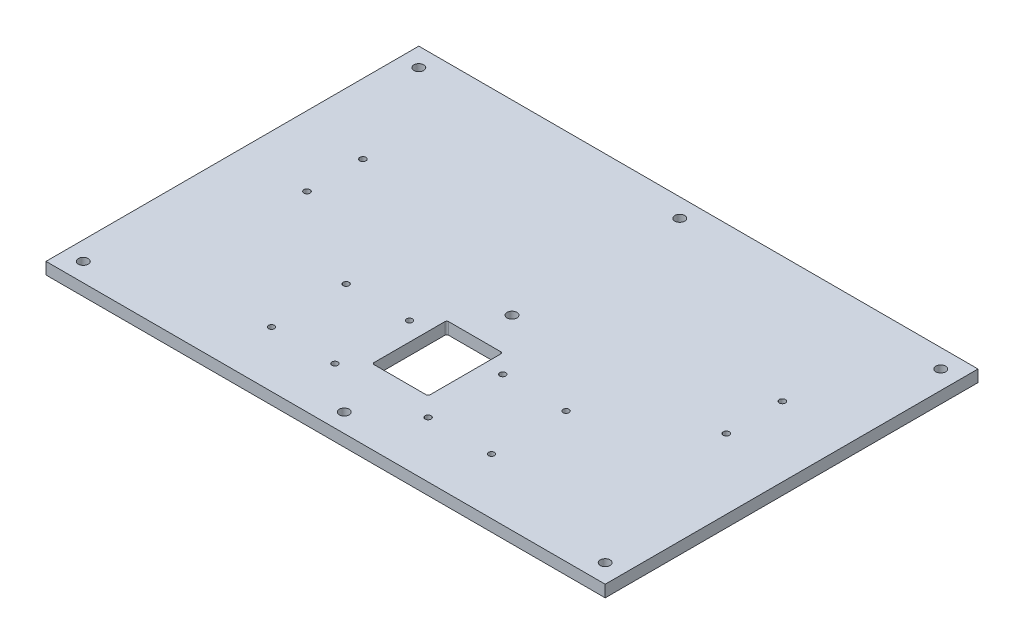
ISO-10303-21;
HEADER;
FILE_DESCRIPTION(('STEP AP214'),'2;1');
FILE_NAME('part.step','',(''),(''),'','','');
FILE_SCHEMA(('AUTOMOTIVE_DESIGN { 1 0 10303 214 1 1 1 1 }'));
ENDSEC;
DATA;
#1=APPLICATION_CONTEXT('core data for automotive mechanical design processes');
#2=APPLICATION_PROTOCOL_DEFINITION('international standard','automotive_design',2000,#1);
#3=PRODUCT_CONTEXT('',#1,'mechanical');
#4=PRODUCT('Part','Part','',(#3));
#5=PRODUCT_RELATED_PRODUCT_CATEGORY('part','',(#4));
#6=PRODUCT_DEFINITION_FORMATION('','',#4);
#7=PRODUCT_DEFINITION_CONTEXT('part definition',#1,'design');
#8=PRODUCT_DEFINITION('design','',#6,#7);
#9=PRODUCT_DEFINITION_SHAPE('','',#8);
#10=(LENGTH_UNIT() NAMED_UNIT(*) SI_UNIT(.MILLI.,.METRE.));
#11=(NAMED_UNIT(*) PLANE_ANGLE_UNIT() SI_UNIT($,.RADIAN.));
#12=(NAMED_UNIT(*) SI_UNIT($,.STERADIAN.) SOLID_ANGLE_UNIT());
#13=UNCERTAINTY_MEASURE_WITH_UNIT(LENGTH_MEASURE(1.E-05),#10,'distance_accuracy_value','');
#14=(GEOMETRIC_REPRESENTATION_CONTEXT(3) GLOBAL_UNCERTAINTY_ASSIGNED_CONTEXT((#13)) GLOBAL_UNIT_ASSIGNED_CONTEXT((#10,
#11,#12)) REPRESENTATION_CONTEXT('',''));
#15=CARTESIAN_POINT('',(0.,0.,0.));
#16=DIRECTION('',(0.,0.,1.));
#17=DIRECTION('',(1.,0.,0.));
#18=AXIS2_PLACEMENT_3D('',#15,#16,#17);
#19=CARTESIAN_POINT('',(0.,-6.35,0.));
#20=DIRECTION('',(0.,1.,0.));
#21=DIRECTION('',(0.,0.,1.));
#22=AXIS2_PLACEMENT_3D('',#19,#20,#21);
#23=PLANE('',#22);
#24=CARTESIAN_POINT('',(-140.,-6.35,-90.));
#25=DIRECTION('',(0.,1.,0.));
#26=DIRECTION('',(0.,0.,1.));
#27=AXIS2_PLACEMENT_3D('',#24,#25,#26);
#28=CIRCLE('',#27,2.64999999999999);
#29=CARTESIAN_POINT('',(-140.,-6.35,-87.35));
#30=VERTEX_POINT('',#29);
#31=EDGE_CURVE('E443',#30,#30,#28,.T.);
#32=ORIENTED_EDGE('',*,*,#31,.T.);
#33=EDGE_LOOP('',(#32));
#34=FACE_BOUND('',#33,.T.);
#35=CARTESIAN_POINT('',(0.,-6.35,-90.));
#36=DIRECTION('',(0.,1.,0.));
#37=DIRECTION('',(0.,0.,1.));
#38=AXIS2_PLACEMENT_3D('',#35,#36,#37);
#39=CIRCLE('',#38,2.65);
#40=CARTESIAN_POINT('',(0.,-6.35,-87.35));
#41=VERTEX_POINT('',#40);
#42=EDGE_CURVE('E435',#41,#41,#39,.T.);
#43=ORIENTED_EDGE('',*,*,#42,.T.);
#44=EDGE_LOOP('',(#43));
#45=FACE_BOUND('',#44,.T.);
#46=CARTESIAN_POINT('',(140.,-6.35,-90.));
#47=DIRECTION('',(0.,1.,0.));
#48=DIRECTION('',(0.,0.,1.));
#49=AXIS2_PLACEMENT_3D('',#46,#47,#48);
#50=CIRCLE('',#49,2.64999999999999);
#51=CARTESIAN_POINT('',(140.,-6.35,-87.35));
#52=VERTEX_POINT('',#51);
#53=EDGE_CURVE('E427',#52,#52,#50,.T.);
#54=ORIENTED_EDGE('',*,*,#53,.T.);
#55=EDGE_LOOP('',(#54));
#56=FACE_BOUND('',#55,.T.);
#57=CARTESIAN_POINT('',(140.,-6.35,90.));
#58=DIRECTION('',(0.,1.,0.));
#59=DIRECTION('',(0.,0.,1.));
#60=AXIS2_PLACEMENT_3D('',#57,#58,#59);
#61=CIRCLE('',#60,2.64999999999999);
#62=CARTESIAN_POINT('',(140.,-6.35,92.6499999999999));
#63=VERTEX_POINT('',#62);
#64=EDGE_CURVE('E419',#63,#63,#61,.T.);
#65=ORIENTED_EDGE('',*,*,#64,.T.);
#66=EDGE_LOOP('',(#65));
#67=FACE_BOUND('',#66,.T.);
#68=CARTESIAN_POINT('',(0.,-6.35,90.));
#69=DIRECTION('',(0.,1.,0.));
#70=DIRECTION('',(0.,0.,1.));
#71=AXIS2_PLACEMENT_3D('',#68,#69,#70);
#72=CIRCLE('',#71,2.65);
#73=CARTESIAN_POINT('',(0.,-6.35,92.65));
#74=VERTEX_POINT('',#73);
#75=EDGE_CURVE('E411',#74,#74,#72,.T.);
#76=ORIENTED_EDGE('',*,*,#75,.T.);
#77=EDGE_LOOP('',(#76));
#78=FACE_BOUND('',#77,.T.);
#79=CARTESIAN_POINT('',(-140.,-6.35,90.));
#80=DIRECTION('',(0.,1.,0.));
#81=DIRECTION('',(0.,0.,1.));
#82=AXIS2_PLACEMENT_3D('',#79,#80,#81);
#83=CIRCLE('',#82,2.64999999999999);
#84=CARTESIAN_POINT('',(-140.,-6.35,92.65));
#85=VERTEX_POINT('',#84);
#86=EDGE_CURVE('E403',#85,#85,#83,.T.);
#87=ORIENTED_EDGE('',*,*,#86,.T.);
#88=EDGE_LOOP('',(#87));
#89=FACE_BOUND('',#88,.T.);
#90=CARTESIAN_POINT('',(0.,-6.35,0.));
#91=DIRECTION('',(0.,1.,0.));
#92=DIRECTION('',(0.,0.,1.));
#93=AXIS2_PLACEMENT_3D('',#90,#91,#92);
#94=CIRCLE('',#93,2.65);
#95=CARTESIAN_POINT('',(0.,-6.35,2.65));
#96=VERTEX_POINT('',#95);
#97=EDGE_CURVE('E395',#96,#96,#94,.T.);
#98=ORIENTED_EDGE('',*,*,#97,.T.);
#99=EDGE_LOOP('',(#98));
#100=FACE_BOUND('',#99,.T.);
#101=CARTESIAN_POINT('',(-59.,-6.35,30.));
#102=DIRECTION('',(0.,1.,0.));
#103=DIRECTION('',(0.,0.,1.));
#104=AXIS2_PLACEMENT_3D('',#101,#102,#103);
#105=CIRCLE('',#104,1.6);
#106=CARTESIAN_POINT('',(-59.,-6.35,31.6));
#107=VERTEX_POINT('',#106);
#108=EDGE_CURVE('E387',#107,#107,#105,.T.);
#109=ORIENTED_EDGE('',*,*,#108,.T.);
#110=EDGE_LOOP('',(#109));
#111=FACE_BOUND('',#110,.T.);
#112=CARTESIAN_POINT('',(-25.,-6.35,30.));
#113=DIRECTION('',(0.,1.,0.));
#114=DIRECTION('',(0.,0.,1.));
#115=AXIS2_PLACEMENT_3D('',#112,#113,#114);
#116=CIRCLE('',#115,1.6);
#117=CARTESIAN_POINT('',(-25.,-6.35,31.6));
#118=VERTEX_POINT('',#117);
#119=EDGE_CURVE('E379',#118,#118,#116,.T.);
#120=ORIENTED_EDGE('',*,*,#119,.T.);
#121=EDGE_LOOP('',(#120));
#122=FACE_BOUND('',#121,.T.);
#123=CARTESIAN_POINT('',(-59.,-6.35,70.));
#124=DIRECTION('',(0.,1.,0.));
#125=DIRECTION('',(0.,0.,1.));
#126=AXIS2_PLACEMENT_3D('',#123,#124,#125);
#127=CIRCLE('',#126,1.6);
#128=CARTESIAN_POINT('',(-59.,-6.35,71.6));
#129=VERTEX_POINT('',#128);
#130=EDGE_CURVE('E371',#129,#129,#127,.T.);
#131=ORIENTED_EDGE('',*,*,#130,.T.);
#132=EDGE_LOOP('',(#131));
#133=FACE_BOUND('',#132,.T.);
#134=CARTESIAN_POINT('',(-25.,-6.35,70.));
#135=DIRECTION('',(0.,1.,0.));
#136=DIRECTION('',(0.,0.,1.));
#137=AXIS2_PLACEMENT_3D('',#134,#135,#136);
#138=CIRCLE('',#137,1.6);
#139=CARTESIAN_POINT('',(-25.,-6.35,71.6));
#140=VERTEX_POINT('',#139);
#141=EDGE_CURVE('E363',#140,#140,#138,.T.);
#142=ORIENTED_EDGE('',*,*,#141,.T.);
#143=EDGE_LOOP('',(#142));
#144=FACE_BOUND('',#143,.T.);
#145=CARTESIAN_POINT('',(25.,-6.35,30.));
#146=DIRECTION('',(0.,1.,0.));
#147=DIRECTION('',(0.,0.,1.));
#148=AXIS2_PLACEMENT_3D('',#145,#146,#147);
#149=CIRCLE('',#148,1.6);
#150=CARTESIAN_POINT('',(25.,-6.35,31.6));
#151=VERTEX_POINT('',#150);
#152=EDGE_CURVE('E355',#151,#151,#149,.T.);
#153=ORIENTED_EDGE('',*,*,#152,.T.);
#154=EDGE_LOOP('',(#153));
#155=FACE_BOUND('',#154,.T.);
#156=CARTESIAN_POINT('',(59.,-6.35,30.));
#157=DIRECTION('',(0.,1.,0.));
#158=DIRECTION('',(0.,0.,1.));
#159=AXIS2_PLACEMENT_3D('',#156,#157,#158);
#160=CIRCLE('',#159,1.6);
#161=CARTESIAN_POINT('',(59.,-6.35,31.6));
#162=VERTEX_POINT('',#161);
#163=EDGE_CURVE('E347',#162,#162,#160,.T.);
#164=ORIENTED_EDGE('',*,*,#163,.T.);
#165=EDGE_LOOP('',(#164));
#166=FACE_BOUND('',#165,.T.);
#167=CARTESIAN_POINT('',(25.,-6.35,70.));
#168=DIRECTION('',(0.,1.,0.));
#169=DIRECTION('',(0.,0.,1.));
#170=AXIS2_PLACEMENT_3D('',#167,#168,#169);
#171=CIRCLE('',#170,1.6);
#172=CARTESIAN_POINT('',(25.,-6.35,71.6));
#173=VERTEX_POINT('',#172);
#174=EDGE_CURVE('E339',#173,#173,#171,.T.);
#175=ORIENTED_EDGE('',*,*,#174,.T.);
#176=EDGE_LOOP('',(#175));
#177=FACE_BOUND('',#176,.T.);
#178=CARTESIAN_POINT('',(59.,-6.35,70.));
#179=DIRECTION('',(0.,1.,0.));
#180=DIRECTION('',(0.,0.,1.));
#181=AXIS2_PLACEMENT_3D('',#178,#179,#180);
#182=CIRCLE('',#181,1.6);
#183=CARTESIAN_POINT('',(59.,-6.35,71.6));
#184=VERTEX_POINT('',#183);
#185=EDGE_CURVE('E331',#184,#184,#182,.T.);
#186=ORIENTED_EDGE('',*,*,#185,.T.);
#187=EDGE_LOOP('',(#186));
#188=FACE_BOUND('',#187,.T.);
#189=CARTESIAN_POINT('',(-112.5,-6.35,-32.5));
#190=DIRECTION('',(0.,1.,0.));
#191=DIRECTION('',(0.,0.,1.));
#192=AXIS2_PLACEMENT_3D('',#189,#190,#191);
#193=CIRCLE('',#192,1.65);
#194=CARTESIAN_POINT('',(-112.5,-6.35,-30.85));
#195=VERTEX_POINT('',#194);
#196=EDGE_CURVE('E323',#195,#195,#193,.T.);
#197=ORIENTED_EDGE('',*,*,#196,.T.);
#198=EDGE_LOOP('',(#197));
#199=FACE_BOUND('',#198,.T.);
#200=CARTESIAN_POINT('',(-112.5,-6.35,-2.5));
#201=DIRECTION('',(0.,1.,0.));
#202=DIRECTION('',(0.,0.,1.));
#203=AXIS2_PLACEMENT_3D('',#200,#201,#202);
#204=CIRCLE('',#203,1.65);
#205=CARTESIAN_POINT('',(-112.5,-6.35,-0.850000000000004));
#206=VERTEX_POINT('',#205);
#207=EDGE_CURVE('E315',#206,#206,#204,.T.);
#208=ORIENTED_EDGE('',*,*,#207,.T.);
#209=EDGE_LOOP('',(#208));
#210=FACE_BOUND('',#209,.T.);
#211=CARTESIAN_POINT('',(112.5,-6.35,-32.5));
#212=DIRECTION('',(0.,1.,0.));
#213=DIRECTION('',(0.,0.,1.));
#214=AXIS2_PLACEMENT_3D('',#211,#212,#213);
#215=CIRCLE('',#214,1.65);
#216=CARTESIAN_POINT('',(112.5,-6.35,-30.85));
#217=VERTEX_POINT('',#216);
#218=EDGE_CURVE('E307',#217,#217,#215,.T.);
#219=ORIENTED_EDGE('',*,*,#218,.T.);
#220=EDGE_LOOP('',(#219));
#221=FACE_BOUND('',#220,.T.);
#222=CARTESIAN_POINT('',(112.5,-6.35,-2.50000000000003));
#223=DIRECTION('',(0.,1.,0.));
#224=DIRECTION('',(0.,0.,1.));
#225=AXIS2_PLACEMENT_3D('',#222,#223,#224);
#226=CIRCLE('',#225,1.65);
#227=CARTESIAN_POINT('',(112.5,-6.35,-0.850000000000031));
#228=VERTEX_POINT('',#227);
#229=EDGE_CURVE('E287',#228,#228,#226,.T.);
#230=ORIENTED_EDGE('',*,*,#229,.T.);
#231=EDGE_LOOP('',(#230));
#232=FACE_BOUND('',#231,.T.);
#233=DIRECTION('',(0.,0.,1.));
#234=VECTOR('',#233,1.);
#235=CARTESIAN_POINT('',(-150.,-6.35,-100.));
#236=LINE('',#235,#234);
#237=CARTESIAN_POINT('',(-150.,-6.35,-100.));
#238=VERTEX_POINT('',#237);
#239=CARTESIAN_POINT('',(-150.,-6.35,100.));
#240=VERTEX_POINT('',#239);
#241=EDGE_CURVE('E169',#238,#240,#236,.T.);
#242=ORIENTED_EDGE('',*,*,#241,.F.);
#243=DIRECTION('',(1.,0.,0.));
#244=VECTOR('',#243,1.);
#245=CARTESIAN_POINT('',(-150.,-6.35,-100.));
#246=LINE('',#245,#244);
#247=CARTESIAN_POINT('',(150.,-6.35,-100.));
#248=VERTEX_POINT('',#247);
#249=EDGE_CURVE('E165',#238,#248,#246,.T.);
#250=ORIENTED_EDGE('',*,*,#249,.T.);
#251=DIRECTION('',(0.,0.,1.));
#252=VECTOR('',#251,1.);
#253=CARTESIAN_POINT('',(150.,-6.35,-100.));
#254=LINE('',#253,#252);
#255=CARTESIAN_POINT('',(150.,-6.35,100.));
#256=VERTEX_POINT('',#255);
#257=EDGE_CURVE('E171',#248,#256,#254,.T.);
#258=ORIENTED_EDGE('',*,*,#257,.T.);
#259=DIRECTION('',(1.,0.,0.));
#260=VECTOR('',#259,1.);
#261=CARTESIAN_POINT('',(-150.,-6.35,100.));
#262=LINE('',#261,#260);
#263=EDGE_CURVE('E156',#240,#256,#262,.T.);
#264=ORIENTED_EDGE('',*,*,#263,.F.);
#265=EDGE_LOOP('',(#242,#250,#258,#264));
#266=FACE_BOUND('',#265,.T.);
#267=DIRECTION('',(0.,0.,1.));
#268=VECTOR('',#267,1.);
#269=CARTESIAN_POINT('',(15.,-6.35,0.));
#270=LINE('',#269,#268);
#271=CARTESIAN_POINT('',(15.,-6.35,21.));
#272=VERTEX_POINT('',#271);
#273=CARTESIAN_POINT('',(15.,-6.35,59.));
#274=VERTEX_POINT('',#273);
#275=EDGE_CURVE('E281',#272,#274,#270,.T.);
#276=ORIENTED_EDGE('',*,*,#275,.F.);
#277=CARTESIAN_POINT('',(14.,-6.35,21.));
#278=DIRECTION('',(0.,1.,0.));
#279=DIRECTION('',(0.,0.,1.));
#280=AXIS2_PLACEMENT_3D('',#277,#278,#279);
#281=CIRCLE('',#280,1.);
#282=CARTESIAN_POINT('',(14.,-6.35,20.));
#283=VERTEX_POINT('',#282);
#284=EDGE_CURVE('E239',#272,#283,#281,.T.);
#285=ORIENTED_EDGE('',*,*,#284,.T.);
#286=DIRECTION('',(1.,0.,0.));
#287=VECTOR('',#286,1.);
#288=CARTESIAN_POINT('',(0.,-6.35,20.));
#289=LINE('',#288,#287);
#290=CARTESIAN_POINT('',(-14.,-6.35,20.));
#291=VERTEX_POINT('',#290);
#292=EDGE_CURVE('E275',#291,#283,#289,.T.);
#293=ORIENTED_EDGE('',*,*,#292,.F.);
#294=CARTESIAN_POINT('',(-14.,-6.35,21.));
#295=DIRECTION('',(0.,1.,0.));
#296=DIRECTION('',(0.,0.,1.));
#297=AXIS2_PLACEMENT_3D('',#294,#295,#296);
#298=CIRCLE('',#297,1.);
#299=CARTESIAN_POINT('',(-15.,-6.35,21.));
#300=VERTEX_POINT('',#299);
#301=EDGE_CURVE('E12',#291,#300,#298,.T.);
#302=ORIENTED_EDGE('',*,*,#301,.T.);
#303=DIRECTION('',(0.,0.,1.));
#304=VECTOR('',#303,1.);
#305=CARTESIAN_POINT('',(-15.,-6.35,0.));
#306=LINE('',#305,#304);
#307=CARTESIAN_POINT('',(-15.,-6.35,59.));
#308=VERTEX_POINT('',#307);
#309=EDGE_CURVE('E272',#300,#308,#306,.T.);
#310=ORIENTED_EDGE('',*,*,#309,.T.);
#311=CARTESIAN_POINT('',(-14.,-6.35,59.));
#312=DIRECTION('',(0.,1.,0.));
#313=DIRECTION('',(0.,0.,1.));
#314=AXIS2_PLACEMENT_3D('',#311,#312,#313);
#315=CIRCLE('',#314,1.);
#316=CARTESIAN_POINT('',(-14.,-6.35,60.));
#317=VERTEX_POINT('',#316);
#318=EDGE_CURVE('E251',#308,#317,#315,.T.);
#319=ORIENTED_EDGE('',*,*,#318,.T.);
#320=DIRECTION('',(1.,0.,0.));
#321=VECTOR('',#320,1.);
#322=CARTESIAN_POINT('',(0.,-6.35,60.));
#323=LINE('',#322,#321);
#324=CARTESIAN_POINT('',(14.,-6.35,60.));
#325=VERTEX_POINT('',#324);
#326=EDGE_CURVE('E195',#317,#325,#323,.T.);
#327=ORIENTED_EDGE('',*,*,#326,.T.);
#328=CARTESIAN_POINT('',(14.,-6.35,59.));
#329=DIRECTION('',(0.,1.,0.));
#330=DIRECTION('',(0.,0.,1.));
#331=AXIS2_PLACEMENT_3D('',#328,#329,#330);
#332=CIRCLE('',#331,1.);
#333=EDGE_CURVE('E245',#325,#274,#332,.T.);
#334=ORIENTED_EDGE('',*,*,#333,.T.);
#335=EDGE_LOOP('',(#276,#285,#293,#302,#310,#319,#327,#334));
#336=FACE_BOUND('',#335,.T.);
#337=ADVANCED_FACE('F63',(#34,#45,#56,#67,#78,#89,#100,#111,#122,#133,#144,#155,#166,#177,#188,
#199,#210,#221,#232,#266,#336),#23,.F.);
#338=CARTESIAN_POINT('',(0.,0.,0.));
#339=DIRECTION('',(0.,1.,0.));
#340=DIRECTION('',(0.,0.,1.));
#341=AXIS2_PLACEMENT_3D('',#338,#339,#340);
#342=PLANE('',#341);
#343=CARTESIAN_POINT('',(-140.,0.,-90.));
#344=DIRECTION('',(0.,1.,0.));
#345=DIRECTION('',(0.,0.,1.));
#346=AXIS2_PLACEMENT_3D('',#343,#344,#345);
#347=CIRCLE('',#346,2.64999999999999);
#348=CARTESIAN_POINT('',(-140.,0.,-87.35));
#349=VERTEX_POINT('',#348);
#350=EDGE_CURVE('E447',#349,#349,#347,.T.);
#351=ORIENTED_EDGE('',*,*,#350,.F.);
#352=EDGE_LOOP('',(#351));
#353=FACE_BOUND('',#352,.T.);
#354=CARTESIAN_POINT('',(0.,0.,-90.));
#355=DIRECTION('',(0.,1.,0.));
#356=DIRECTION('',(0.,0.,1.));
#357=AXIS2_PLACEMENT_3D('',#354,#355,#356);
#358=CIRCLE('',#357,2.65);
#359=CARTESIAN_POINT('',(0.,0.,-87.35));
#360=VERTEX_POINT('',#359);
#361=EDGE_CURVE('E439',#360,#360,#358,.T.);
#362=ORIENTED_EDGE('',*,*,#361,.F.);
#363=EDGE_LOOP('',(#362));
#364=FACE_BOUND('',#363,.T.);
#365=CARTESIAN_POINT('',(140.,0.,-90.));
#366=DIRECTION('',(0.,1.,0.));
#367=DIRECTION('',(0.,0.,1.));
#368=AXIS2_PLACEMENT_3D('',#365,#366,#367);
#369=CIRCLE('',#368,2.64999999999999);
#370=CARTESIAN_POINT('',(140.,0.,-87.35));
#371=VERTEX_POINT('',#370);
#372=EDGE_CURVE('E431',#371,#371,#369,.T.);
#373=ORIENTED_EDGE('',*,*,#372,.F.);
#374=EDGE_LOOP('',(#373));
#375=FACE_BOUND('',#374,.T.);
#376=CARTESIAN_POINT('',(140.,0.,90.));
#377=DIRECTION('',(0.,1.,0.));
#378=DIRECTION('',(0.,0.,1.));
#379=AXIS2_PLACEMENT_3D('',#376,#377,#378);
#380=CIRCLE('',#379,2.64999999999999);
#381=CARTESIAN_POINT('',(140.,0.,92.6499999999999));
#382=VERTEX_POINT('',#381);
#383=EDGE_CURVE('E423',#382,#382,#380,.T.);
#384=ORIENTED_EDGE('',*,*,#383,.F.);
#385=EDGE_LOOP('',(#384));
#386=FACE_BOUND('',#385,.T.);
#387=CARTESIAN_POINT('',(0.,0.,90.));
#388=DIRECTION('',(0.,1.,0.));
#389=DIRECTION('',(0.,0.,1.));
#390=AXIS2_PLACEMENT_3D('',#387,#388,#389);
#391=CIRCLE('',#390,2.65);
#392=CARTESIAN_POINT('',(0.,0.,92.65));
#393=VERTEX_POINT('',#392);
#394=EDGE_CURVE('E415',#393,#393,#391,.T.);
#395=ORIENTED_EDGE('',*,*,#394,.F.);
#396=EDGE_LOOP('',(#395));
#397=FACE_BOUND('',#396,.T.);
#398=CARTESIAN_POINT('',(-140.,0.,90.));
#399=DIRECTION('',(0.,1.,0.));
#400=DIRECTION('',(0.,0.,1.));
#401=AXIS2_PLACEMENT_3D('',#398,#399,#400);
#402=CIRCLE('',#401,2.64999999999999);
#403=CARTESIAN_POINT('',(-140.,0.,92.65));
#404=VERTEX_POINT('',#403);
#405=EDGE_CURVE('E407',#404,#404,#402,.T.);
#406=ORIENTED_EDGE('',*,*,#405,.F.);
#407=EDGE_LOOP('',(#406));
#408=FACE_BOUND('',#407,.T.);
#409=CARTESIAN_POINT('',(0.,0.,0.));
#410=DIRECTION('',(0.,1.,0.));
#411=DIRECTION('',(0.,0.,1.));
#412=AXIS2_PLACEMENT_3D('',#409,#410,#411);
#413=CIRCLE('',#412,2.65);
#414=CARTESIAN_POINT('',(0.,0.,2.65));
#415=VERTEX_POINT('',#414);
#416=EDGE_CURVE('E399',#415,#415,#413,.T.);
#417=ORIENTED_EDGE('',*,*,#416,.F.);
#418=EDGE_LOOP('',(#417));
#419=FACE_BOUND('',#418,.T.);
#420=CARTESIAN_POINT('',(-59.,0.,30.));
#421=DIRECTION('',(0.,1.,0.));
#422=DIRECTION('',(0.,0.,1.));
#423=AXIS2_PLACEMENT_3D('',#420,#421,#422);
#424=CIRCLE('',#423,1.6);
#425=CARTESIAN_POINT('',(-59.,0.,31.6));
#426=VERTEX_POINT('',#425);
#427=EDGE_CURVE('E391',#426,#426,#424,.T.);
#428=ORIENTED_EDGE('',*,*,#427,.F.);
#429=EDGE_LOOP('',(#428));
#430=FACE_BOUND('',#429,.T.);
#431=CARTESIAN_POINT('',(-25.,0.,30.));
#432=DIRECTION('',(0.,1.,0.));
#433=DIRECTION('',(0.,0.,1.));
#434=AXIS2_PLACEMENT_3D('',#431,#432,#433);
#435=CIRCLE('',#434,1.6);
#436=CARTESIAN_POINT('',(-25.,0.,31.6));
#437=VERTEX_POINT('',#436);
#438=EDGE_CURVE('E383',#437,#437,#435,.T.);
#439=ORIENTED_EDGE('',*,*,#438,.F.);
#440=EDGE_LOOP('',(#439));
#441=FACE_BOUND('',#440,.T.);
#442=CARTESIAN_POINT('',(-59.,0.,70.));
#443=DIRECTION('',(0.,1.,0.));
#444=DIRECTION('',(0.,0.,1.));
#445=AXIS2_PLACEMENT_3D('',#442,#443,#444);
#446=CIRCLE('',#445,1.6);
#447=CARTESIAN_POINT('',(-59.,0.,71.6));
#448=VERTEX_POINT('',#447);
#449=EDGE_CURVE('E375',#448,#448,#446,.T.);
#450=ORIENTED_EDGE('',*,*,#449,.F.);
#451=EDGE_LOOP('',(#450));
#452=FACE_BOUND('',#451,.T.);
#453=CARTESIAN_POINT('',(-25.,0.,70.));
#454=DIRECTION('',(0.,1.,0.));
#455=DIRECTION('',(0.,0.,1.));
#456=AXIS2_PLACEMENT_3D('',#453,#454,#455);
#457=CIRCLE('',#456,1.6);
#458=CARTESIAN_POINT('',(-25.,0.,71.6));
#459=VERTEX_POINT('',#458);
#460=EDGE_CURVE('E367',#459,#459,#457,.T.);
#461=ORIENTED_EDGE('',*,*,#460,.F.);
#462=EDGE_LOOP('',(#461));
#463=FACE_BOUND('',#462,.T.);
#464=CARTESIAN_POINT('',(25.,0.,30.));
#465=DIRECTION('',(0.,1.,0.));
#466=DIRECTION('',(0.,0.,1.));
#467=AXIS2_PLACEMENT_3D('',#464,#465,#466);
#468=CIRCLE('',#467,1.6);
#469=CARTESIAN_POINT('',(25.,0.,31.6));
#470=VERTEX_POINT('',#469);
#471=EDGE_CURVE('E359',#470,#470,#468,.T.);
#472=ORIENTED_EDGE('',*,*,#471,.F.);
#473=EDGE_LOOP('',(#472));
#474=FACE_BOUND('',#473,.T.);
#475=CARTESIAN_POINT('',(59.,0.,30.));
#476=DIRECTION('',(0.,1.,0.));
#477=DIRECTION('',(0.,0.,1.));
#478=AXIS2_PLACEMENT_3D('',#475,#476,#477);
#479=CIRCLE('',#478,1.6);
#480=CARTESIAN_POINT('',(59.,0.,31.6));
#481=VERTEX_POINT('',#480);
#482=EDGE_CURVE('E351',#481,#481,#479,.T.);
#483=ORIENTED_EDGE('',*,*,#482,.F.);
#484=EDGE_LOOP('',(#483));
#485=FACE_BOUND('',#484,.T.);
#486=CARTESIAN_POINT('',(25.,0.,70.));
#487=DIRECTION('',(0.,1.,0.));
#488=DIRECTION('',(0.,0.,1.));
#489=AXIS2_PLACEMENT_3D('',#486,#487,#488);
#490=CIRCLE('',#489,1.6);
#491=CARTESIAN_POINT('',(25.,0.,71.6));
#492=VERTEX_POINT('',#491);
#493=EDGE_CURVE('E343',#492,#492,#490,.T.);
#494=ORIENTED_EDGE('',*,*,#493,.F.);
#495=EDGE_LOOP('',(#494));
#496=FACE_BOUND('',#495,.T.);
#497=CARTESIAN_POINT('',(59.,0.,70.));
#498=DIRECTION('',(0.,1.,0.));
#499=DIRECTION('',(0.,0.,1.));
#500=AXIS2_PLACEMENT_3D('',#497,#498,#499);
#501=CIRCLE('',#500,1.6);
#502=CARTESIAN_POINT('',(59.,0.,71.6));
#503=VERTEX_POINT('',#502);
#504=EDGE_CURVE('E335',#503,#503,#501,.T.);
#505=ORIENTED_EDGE('',*,*,#504,.F.);
#506=EDGE_LOOP('',(#505));
#507=FACE_BOUND('',#506,.T.);
#508=CARTESIAN_POINT('',(-112.5,0.,-32.5));
#509=DIRECTION('',(0.,1.,0.));
#510=DIRECTION('',(0.,0.,1.));
#511=AXIS2_PLACEMENT_3D('',#508,#509,#510);
#512=CIRCLE('',#511,1.65);
#513=CARTESIAN_POINT('',(-112.5,0.,-30.85));
#514=VERTEX_POINT('',#513);
#515=EDGE_CURVE('E327',#514,#514,#512,.T.);
#516=ORIENTED_EDGE('',*,*,#515,.F.);
#517=EDGE_LOOP('',(#516));
#518=FACE_BOUND('',#517,.T.);
#519=CARTESIAN_POINT('',(-112.5,0.,-2.5));
#520=DIRECTION('',(0.,1.,0.));
#521=DIRECTION('',(0.,0.,1.));
#522=AXIS2_PLACEMENT_3D('',#519,#520,#521);
#523=CIRCLE('',#522,1.65);
#524=CARTESIAN_POINT('',(-112.5,0.,-0.850000000000004));
#525=VERTEX_POINT('',#524);
#526=EDGE_CURVE('E319',#525,#525,#523,.T.);
#527=ORIENTED_EDGE('',*,*,#526,.F.);
#528=EDGE_LOOP('',(#527));
#529=FACE_BOUND('',#528,.T.);
#530=CARTESIAN_POINT('',(112.5,0.,-32.5));
#531=DIRECTION('',(0.,1.,0.));
#532=DIRECTION('',(0.,0.,1.));
#533=AXIS2_PLACEMENT_3D('',#530,#531,#532);
#534=CIRCLE('',#533,1.65);
#535=CARTESIAN_POINT('',(112.5,0.,-30.85));
#536=VERTEX_POINT('',#535);
#537=EDGE_CURVE('E311',#536,#536,#534,.T.);
#538=ORIENTED_EDGE('',*,*,#537,.F.);
#539=EDGE_LOOP('',(#538));
#540=FACE_BOUND('',#539,.T.);
#541=CARTESIAN_POINT('',(112.5,0.,-2.50000000000003));
#542=DIRECTION('',(0.,1.,0.));
#543=DIRECTION('',(0.,0.,1.));
#544=AXIS2_PLACEMENT_3D('',#541,#542,#543);
#545=CIRCLE('',#544,1.65);
#546=CARTESIAN_POINT('',(112.5,0.,-0.850000000000031));
#547=VERTEX_POINT('',#546);
#548=EDGE_CURVE('E303',#547,#547,#545,.T.);
#549=ORIENTED_EDGE('',*,*,#548,.F.);
#550=EDGE_LOOP('',(#549));
#551=FACE_BOUND('',#550,.T.);
#552=DIRECTION('',(0.,0.,1.));
#553=VECTOR('',#552,1.);
#554=CARTESIAN_POINT('',(-150.,0.,-100.));
#555=LINE('',#554,#553);
#556=CARTESIAN_POINT('',(-150.,0.,-100.));
#557=VERTEX_POINT('',#556);
#558=CARTESIAN_POINT('',(-150.,0.,100.));
#559=VERTEX_POINT('',#558);
#560=EDGE_CURVE('E192',#557,#559,#555,.T.);
#561=ORIENTED_EDGE('',*,*,#560,.T.);
#562=DIRECTION('',(1.,0.,0.));
#563=VECTOR('',#562,1.);
#564=CARTESIAN_POINT('',(-150.,0.,100.));
#565=LINE('',#564,#563);
#566=CARTESIAN_POINT('',(150.,0.,100.));
#567=VERTEX_POINT('',#566);
#568=EDGE_CURVE('E158',#559,#567,#565,.T.);
#569=ORIENTED_EDGE('',*,*,#568,.T.);
#570=DIRECTION('',(0.,0.,1.));
#571=VECTOR('',#570,1.);
#572=CARTESIAN_POINT('',(150.,0.,-100.));
#573=LINE('',#572,#571);
#574=CARTESIAN_POINT('',(150.,0.,-100.));
#575=VERTEX_POINT('',#574);
#576=EDGE_CURVE('E182',#575,#567,#573,.T.);
#577=ORIENTED_EDGE('',*,*,#576,.F.);
#578=DIRECTION('',(1.,0.,0.));
#579=VECTOR('',#578,1.);
#580=CARTESIAN_POINT('',(-150.,0.,-100.));
#581=LINE('',#580,#579);
#582=EDGE_CURVE('E179',#557,#575,#581,.T.);
#583=ORIENTED_EDGE('',*,*,#582,.F.);
#584=EDGE_LOOP('',(#561,#569,#577,#583));
#585=FACE_BOUND('',#584,.T.);
#586=DIRECTION('',(0.,0.,1.));
#587=VECTOR('',#586,1.);
#588=CARTESIAN_POINT('',(-15.,0.,0.));
#589=LINE('',#588,#587);
#590=CARTESIAN_POINT('',(-15.,0.,21.));
#591=VERTEX_POINT('',#590);
#592=CARTESIAN_POINT('',(-15.,0.,59.));
#593=VERTEX_POINT('',#592);
#594=EDGE_CURVE('E260',#591,#593,#589,.T.);
#595=ORIENTED_EDGE('',*,*,#594,.F.);
#596=CARTESIAN_POINT('',(-14.,0.,21.));
#597=DIRECTION('',(0.,1.,0.));
#598=DIRECTION('',(0.,0.,1.));
#599=AXIS2_PLACEMENT_3D('',#596,#597,#598);
#600=CIRCLE('',#599,1.);
#601=CARTESIAN_POINT('',(-14.,0.,20.));
#602=VERTEX_POINT('',#601);
#603=EDGE_CURVE('E72',#591,#602,#600,.F.);
#604=ORIENTED_EDGE('',*,*,#603,.T.);
#605=DIRECTION('',(1.,0.,0.));
#606=VECTOR('',#605,1.);
#607=CARTESIAN_POINT('',(0.,0.,20.));
#608=LINE('',#607,#606);
#609=CARTESIAN_POINT('',(14.,0.,20.));
#610=VERTEX_POINT('',#609);
#611=EDGE_CURVE('E259',#602,#610,#608,.T.);
#612=ORIENTED_EDGE('',*,*,#611,.T.);
#613=CARTESIAN_POINT('',(14.,0.,21.));
#614=DIRECTION('',(0.,1.,0.));
#615=DIRECTION('',(0.,0.,1.));
#616=AXIS2_PLACEMENT_3D('',#613,#614,#615);
#617=CIRCLE('',#616,1.);
#618=CARTESIAN_POINT('',(15.,0.,21.));
#619=VERTEX_POINT('',#618);
#620=EDGE_CURVE('E236',#610,#619,#617,.F.);
#621=ORIENTED_EDGE('',*,*,#620,.T.);
#622=DIRECTION('',(0.,0.,1.));
#623=VECTOR('',#622,1.);
#624=CARTESIAN_POINT('',(15.,0.,0.));
#625=LINE('',#624,#623);
#626=CARTESIAN_POINT('',(15.,0.,59.));
#627=VERTEX_POINT('',#626);
#628=EDGE_CURVE('E269',#619,#627,#625,.T.);
#629=ORIENTED_EDGE('',*,*,#628,.T.);
#630=CARTESIAN_POINT('',(14.,0.,59.));
#631=DIRECTION('',(0.,1.,0.));
#632=DIRECTION('',(0.,0.,1.));
#633=AXIS2_PLACEMENT_3D('',#630,#631,#632);
#634=CIRCLE('',#633,1.);
#635=CARTESIAN_POINT('',(14.,0.,60.));
#636=VERTEX_POINT('',#635);
#637=EDGE_CURVE('E242',#627,#636,#634,.F.);
#638=ORIENTED_EDGE('',*,*,#637,.T.);
#639=DIRECTION('',(1.,0.,0.));
#640=VECTOR('',#639,1.);
#641=CARTESIAN_POINT('',(0.,0.,60.));
#642=LINE('',#641,#640);
#643=CARTESIAN_POINT('',(-14.,0.,60.));
#644=VERTEX_POINT('',#643);
#645=EDGE_CURVE('E185',#644,#636,#642,.T.);
#646=ORIENTED_EDGE('',*,*,#645,.F.);
#647=CARTESIAN_POINT('',(-14.,0.,59.));
#648=DIRECTION('',(0.,1.,0.));
#649=DIRECTION('',(0.,0.,1.));
#650=AXIS2_PLACEMENT_3D('',#647,#648,#649);
#651=CIRCLE('',#650,1.);
#652=EDGE_CURVE('E248',#644,#593,#651,.F.);
#653=ORIENTED_EDGE('',*,*,#652,.T.);
#654=EDGE_LOOP('',(#595,#604,#612,#621,#629,#638,#646,#653));
#655=FACE_BOUND('',#654,.T.);
#656=ADVANCED_FACE('F258',(#353,#364,#375,#386,#397,#408,#419,#430,#441,#452,#463,#474,#485,
#496,#507,#518,#529,#540,#551,#585,#655),#342,.T.);
#657=CARTESIAN_POINT('',(-150.,-6.35,-100.));
#658=DIRECTION('',(-1.,0.,0.));
#659=DIRECTION('',(0.,0.,1.));
#660=AXIS2_PLACEMENT_3D('',#657,#658,#659);
#661=PLANE('',#660);
#662=ORIENTED_EDGE('',*,*,#560,.F.);
#663=DIRECTION('',(0.,1.,0.));
#664=VECTOR('',#663,1.);
#665=CARTESIAN_POINT('',(-150.,-6.35,-100.));
#666=LINE('',#665,#664);
#667=EDGE_CURVE('E176',#238,#557,#666,.T.);
#668=ORIENTED_EDGE('',*,*,#667,.F.);
#669=ORIENTED_EDGE('',*,*,#241,.T.);
#670=DIRECTION('',(0.,1.,0.));
#671=VECTOR('',#670,1.);
#672=CARTESIAN_POINT('',(-150.,-6.35,100.));
#673=LINE('',#672,#671);
#674=EDGE_CURVE('E153',#240,#559,#673,.T.);
#675=ORIENTED_EDGE('',*,*,#674,.T.);
#676=EDGE_LOOP('',(#662,#668,#669,#675));
#677=FACE_BOUND('',#676,.T.);
#678=ADVANCED_FACE('F175',(#677),#661,.T.);
#679=CARTESIAN_POINT('',(-150.,-6.35,-100.));
#680=DIRECTION('',(0.,0.,1.));
#681=DIRECTION('',(1.,0.,0.));
#682=AXIS2_PLACEMENT_3D('',#679,#680,#681);
#683=PLANE('',#682);
#684=ORIENTED_EDGE('',*,*,#582,.T.);
#685=DIRECTION('',(0.,1.,0.));
#686=VECTOR('',#685,1.);
#687=CARTESIAN_POINT('',(150.,-6.35,-100.));
#688=LINE('',#687,#686);
#689=EDGE_CURVE('E204',#248,#575,#688,.T.);
#690=ORIENTED_EDGE('',*,*,#689,.F.);
#691=ORIENTED_EDGE('',*,*,#249,.F.);
#692=ORIENTED_EDGE('',*,*,#667,.T.);
#693=EDGE_LOOP('',(#684,#690,#691,#692));
#694=FACE_BOUND('',#693,.T.);
#695=ADVANCED_FACE('F497',(#694),#683,.F.);
#696=CARTESIAN_POINT('',(150.,-6.35,-100.));
#697=DIRECTION('',(-1.,0.,0.));
#698=DIRECTION('',(0.,0.,1.));
#699=AXIS2_PLACEMENT_3D('',#696,#697,#698);
#700=PLANE('',#699);
#701=ORIENTED_EDGE('',*,*,#576,.T.);
#702=DIRECTION('',(0.,1.,0.));
#703=VECTOR('',#702,1.);
#704=CARTESIAN_POINT('',(150.,-6.35,100.));
#705=LINE('',#704,#703);
#706=EDGE_CURVE('E164',#256,#567,#705,.T.);
#707=ORIENTED_EDGE('',*,*,#706,.F.);
#708=ORIENTED_EDGE('',*,*,#257,.F.);
#709=ORIENTED_EDGE('',*,*,#689,.T.);
#710=EDGE_LOOP('',(#701,#707,#708,#709));
#711=FACE_BOUND('',#710,.T.);
#712=ADVANCED_FACE('F499',(#711),#700,.F.);
#713=CARTESIAN_POINT('',(-150.,-6.35,100.));
#714=DIRECTION('',(0.,0.,1.));
#715=DIRECTION('',(1.,0.,0.));
#716=AXIS2_PLACEMENT_3D('',#713,#714,#715);
#717=PLANE('',#716);
#718=ORIENTED_EDGE('',*,*,#568,.F.);
#719=ORIENTED_EDGE('',*,*,#674,.F.);
#720=ORIENTED_EDGE('',*,*,#263,.T.);
#721=ORIENTED_EDGE('',*,*,#706,.T.);
#722=EDGE_LOOP('',(#718,#719,#720,#721));
#723=FACE_BOUND('',#722,.T.);
#724=ADVANCED_FACE('F155',(#723),#717,.T.);
#725=CARTESIAN_POINT('',(15.,-6.35,0.));
#726=DIRECTION('',(-1.,0.,0.));
#727=DIRECTION('',(0.,0.,1.));
#728=AXIS2_PLACEMENT_3D('',#725,#726,#727);
#729=PLANE('',#728);
#730=ORIENTED_EDGE('',*,*,#628,.F.);
#731=DIRECTION('',(0.,1.,0.));
#732=VECTOR('',#731,1.);
#733=CARTESIAN_POINT('',(15.,-6.35,21.));
#734=LINE('',#733,#732);
#735=EDGE_CURVE('E220',#619,#272,#734,.F.);
#736=ORIENTED_EDGE('',*,*,#735,.T.);
#737=ORIENTED_EDGE('',*,*,#275,.T.);
#738=DIRECTION('',(0.,1.,0.));
#739=VECTOR('',#738,1.);
#740=CARTESIAN_POINT('',(15.,-6.35,59.));
#741=LINE('',#740,#739);
#742=EDGE_CURVE('E216',#274,#627,#741,.T.);
#743=ORIENTED_EDGE('',*,*,#742,.T.);
#744=EDGE_LOOP('',(#730,#736,#737,#743));
#745=FACE_BOUND('',#744,.T.);
#746=ADVANCED_FACE('F506',(#745),#729,.T.);
#747=CARTESIAN_POINT('',(0.,-6.35,60.));
#748=DIRECTION('',(0.,0.,1.));
#749=DIRECTION('',(1.,0.,0.));
#750=AXIS2_PLACEMENT_3D('',#747,#748,#749);
#751=PLANE('',#750);
#752=ORIENTED_EDGE('',*,*,#645,.T.);
#753=DIRECTION('',(0.,1.,0.));
#754=VECTOR('',#753,1.);
#755=CARTESIAN_POINT('',(14.,-6.35,60.));
#756=LINE('',#755,#754);
#757=EDGE_CURVE('E227',#636,#325,#756,.F.);
#758=ORIENTED_EDGE('',*,*,#757,.T.);
#759=ORIENTED_EDGE('',*,*,#326,.F.);
#760=DIRECTION('',(0.,1.,0.));
#761=VECTOR('',#760,1.);
#762=CARTESIAN_POINT('',(-14.,0.,60.));
#763=LINE('',#762,#761);
#764=EDGE_CURVE('E223',#317,#644,#763,.T.);
#765=ORIENTED_EDGE('',*,*,#764,.T.);
#766=EDGE_LOOP('',(#752,#758,#759,#765));
#767=FACE_BOUND('',#766,.T.);
#768=ADVANCED_FACE('F518',(#767),#751,.F.);
#769=CARTESIAN_POINT('',(-15.,-6.35,0.));
#770=DIRECTION('',(-1.,0.,0.));
#771=DIRECTION('',(0.,0.,1.));
#772=AXIS2_PLACEMENT_3D('',#769,#770,#771);
#773=PLANE('',#772);
#774=ORIENTED_EDGE('',*,*,#594,.T.);
#775=DIRECTION('',(0.,1.,0.));
#776=VECTOR('',#775,1.);
#777=CARTESIAN_POINT('',(-15.,-6.35,59.));
#778=LINE('',#777,#776);
#779=EDGE_CURVE('E79',#593,#308,#778,.F.);
#780=ORIENTED_EDGE('',*,*,#779,.T.);
#781=ORIENTED_EDGE('',*,*,#309,.F.);
#782=DIRECTION('',(0.,1.,0.));
#783=VECTOR('',#782,1.);
#784=CARTESIAN_POINT('',(-15.,-6.35,21.));
#785=LINE('',#784,#783);
#786=EDGE_CURVE('E230',#300,#591,#785,.T.);
#787=ORIENTED_EDGE('',*,*,#786,.T.);
#788=EDGE_LOOP('',(#774,#780,#781,#787));
#789=FACE_BOUND('',#788,.T.);
#790=ADVANCED_FACE('F271',(#789),#773,.F.);
#791=CARTESIAN_POINT('',(0.,-6.35,20.));
#792=DIRECTION('',(0.,0.,1.));
#793=DIRECTION('',(1.,0.,0.));
#794=AXIS2_PLACEMENT_3D('',#791,#792,#793);
#795=PLANE('',#794);
#796=ORIENTED_EDGE('',*,*,#292,.T.);
#797=DIRECTION('',(0.,1.,0.));
#798=VECTOR('',#797,1.);
#799=CARTESIAN_POINT('',(14.,0.,20.));
#800=LINE('',#799,#798);
#801=EDGE_CURVE('E212',#283,#610,#800,.T.);
#802=ORIENTED_EDGE('',*,*,#801,.T.);
#803=ORIENTED_EDGE('',*,*,#611,.F.);
#804=DIRECTION('',(0.,1.,0.));
#805=VECTOR('',#804,1.);
#806=CARTESIAN_POINT('',(-14.,-6.35,20.));
#807=LINE('',#806,#805);
#808=EDGE_CURVE('E203',#602,#291,#807,.F.);
#809=ORIENTED_EDGE('',*,*,#808,.T.);
#810=EDGE_LOOP('',(#796,#802,#803,#809));
#811=FACE_BOUND('',#810,.T.);
#812=ADVANCED_FACE('F266',(#811),#795,.T.);
#813=CARTESIAN_POINT('',(112.5,0.,-2.50000000000003));
#814=DIRECTION('',(0.,1.,0.));
#815=DIRECTION('',(0.,0.,1.));
#816=AXIS2_PLACEMENT_3D('',#813,#814,#815);
#817=CYLINDRICAL_SURFACE('',#816,1.65);
#818=ORIENTED_EDGE('',*,*,#229,.F.);
#819=EDGE_LOOP('',(#818));
#820=FACE_BOUND('',#819,.T.);
#821=ORIENTED_EDGE('',*,*,#548,.T.);
#822=EDGE_LOOP('',(#821));
#823=FACE_BOUND('',#822,.T.);
#824=ADVANCED_FACE('F521',(#820,#823),#817,.F.);
#825=CARTESIAN_POINT('',(112.5,0.,-32.5));
#826=DIRECTION('',(0.,1.,0.));
#827=DIRECTION('',(0.,0.,1.));
#828=AXIS2_PLACEMENT_3D('',#825,#826,#827);
#829=CYLINDRICAL_SURFACE('',#828,1.65);
#830=ORIENTED_EDGE('',*,*,#218,.F.);
#831=EDGE_LOOP('',(#830));
#832=FACE_BOUND('',#831,.T.);
#833=ORIENTED_EDGE('',*,*,#537,.T.);
#834=EDGE_LOOP('',(#833));
#835=FACE_BOUND('',#834,.T.);
#836=ADVANCED_FACE('F528',(#832,#835),#829,.F.);
#837=CARTESIAN_POINT('',(-112.5,0.,-2.5));
#838=DIRECTION('',(0.,1.,0.));
#839=DIRECTION('',(0.,0.,1.));
#840=AXIS2_PLACEMENT_3D('',#837,#838,#839);
#841=CYLINDRICAL_SURFACE('',#840,1.65);
#842=ORIENTED_EDGE('',*,*,#207,.F.);
#843=EDGE_LOOP('',(#842));
#844=FACE_BOUND('',#843,.T.);
#845=ORIENTED_EDGE('',*,*,#526,.T.);
#846=EDGE_LOOP('',(#845));
#847=FACE_BOUND('',#846,.T.);
#848=ADVANCED_FACE('F532',(#844,#847),#841,.F.);
#849=CARTESIAN_POINT('',(-112.5,0.,-32.5));
#850=DIRECTION('',(0.,1.,0.));
#851=DIRECTION('',(0.,0.,1.));
#852=AXIS2_PLACEMENT_3D('',#849,#850,#851);
#853=CYLINDRICAL_SURFACE('',#852,1.65);
#854=ORIENTED_EDGE('',*,*,#196,.F.);
#855=EDGE_LOOP('',(#854));
#856=FACE_BOUND('',#855,.T.);
#857=ORIENTED_EDGE('',*,*,#515,.T.);
#858=EDGE_LOOP('',(#857));
#859=FACE_BOUND('',#858,.T.);
#860=ADVANCED_FACE('F536',(#856,#859),#853,.F.);
#861=CARTESIAN_POINT('',(59.,0.,70.));
#862=DIRECTION('',(0.,1.,0.));
#863=DIRECTION('',(0.,0.,1.));
#864=AXIS2_PLACEMENT_3D('',#861,#862,#863);
#865=CYLINDRICAL_SURFACE('',#864,1.6);
#866=ORIENTED_EDGE('',*,*,#185,.F.);
#867=EDGE_LOOP('',(#866));
#868=FACE_BOUND('',#867,.T.);
#869=ORIENTED_EDGE('',*,*,#504,.T.);
#870=EDGE_LOOP('',(#869));
#871=FACE_BOUND('',#870,.T.);
#872=ADVANCED_FACE('F540',(#868,#871),#865,.F.);
#873=CARTESIAN_POINT('',(25.,0.,70.));
#874=DIRECTION('',(0.,1.,0.));
#875=DIRECTION('',(0.,0.,1.));
#876=AXIS2_PLACEMENT_3D('',#873,#874,#875);
#877=CYLINDRICAL_SURFACE('',#876,1.6);
#878=ORIENTED_EDGE('',*,*,#174,.F.);
#879=EDGE_LOOP('',(#878));
#880=FACE_BOUND('',#879,.T.);
#881=ORIENTED_EDGE('',*,*,#493,.T.);
#882=EDGE_LOOP('',(#881));
#883=FACE_BOUND('',#882,.T.);
#884=ADVANCED_FACE('F544',(#880,#883),#877,.F.);
#885=CARTESIAN_POINT('',(59.,0.,30.));
#886=DIRECTION('',(0.,1.,0.));
#887=DIRECTION('',(0.,0.,1.));
#888=AXIS2_PLACEMENT_3D('',#885,#886,#887);
#889=CYLINDRICAL_SURFACE('',#888,1.6);
#890=ORIENTED_EDGE('',*,*,#163,.F.);
#891=EDGE_LOOP('',(#890));
#892=FACE_BOUND('',#891,.T.);
#893=ORIENTED_EDGE('',*,*,#482,.T.);
#894=EDGE_LOOP('',(#893));
#895=FACE_BOUND('',#894,.T.);
#896=ADVANCED_FACE('F548',(#892,#895),#889,.F.);
#897=CARTESIAN_POINT('',(25.,0.,30.));
#898=DIRECTION('',(0.,1.,0.));
#899=DIRECTION('',(0.,0.,1.));
#900=AXIS2_PLACEMENT_3D('',#897,#898,#899);
#901=CYLINDRICAL_SURFACE('',#900,1.6);
#902=ORIENTED_EDGE('',*,*,#152,.F.);
#903=EDGE_LOOP('',(#902));
#904=FACE_BOUND('',#903,.T.);
#905=ORIENTED_EDGE('',*,*,#471,.T.);
#906=EDGE_LOOP('',(#905));
#907=FACE_BOUND('',#906,.T.);
#908=ADVANCED_FACE('F552',(#904,#907),#901,.F.);
#909=CARTESIAN_POINT('',(-25.,0.,70.));
#910=DIRECTION('',(0.,1.,0.));
#911=DIRECTION('',(0.,0.,1.));
#912=AXIS2_PLACEMENT_3D('',#909,#910,#911);
#913=CYLINDRICAL_SURFACE('',#912,1.6);
#914=ORIENTED_EDGE('',*,*,#141,.F.);
#915=EDGE_LOOP('',(#914));
#916=FACE_BOUND('',#915,.T.);
#917=ORIENTED_EDGE('',*,*,#460,.T.);
#918=EDGE_LOOP('',(#917));
#919=FACE_BOUND('',#918,.T.);
#920=ADVANCED_FACE('F556',(#916,#919),#913,.F.);
#921=CARTESIAN_POINT('',(-59.,0.,70.));
#922=DIRECTION('',(0.,1.,0.));
#923=DIRECTION('',(0.,0.,1.));
#924=AXIS2_PLACEMENT_3D('',#921,#922,#923);
#925=CYLINDRICAL_SURFACE('',#924,1.6);
#926=ORIENTED_EDGE('',*,*,#130,.F.);
#927=EDGE_LOOP('',(#926));
#928=FACE_BOUND('',#927,.T.);
#929=ORIENTED_EDGE('',*,*,#449,.T.);
#930=EDGE_LOOP('',(#929));
#931=FACE_BOUND('',#930,.T.);
#932=ADVANCED_FACE('F560',(#928,#931),#925,.F.);
#933=CARTESIAN_POINT('',(-25.,0.,30.));
#934=DIRECTION('',(0.,1.,0.));
#935=DIRECTION('',(0.,0.,1.));
#936=AXIS2_PLACEMENT_3D('',#933,#934,#935);
#937=CYLINDRICAL_SURFACE('',#936,1.6);
#938=ORIENTED_EDGE('',*,*,#119,.F.);
#939=EDGE_LOOP('',(#938));
#940=FACE_BOUND('',#939,.T.);
#941=ORIENTED_EDGE('',*,*,#438,.T.);
#942=EDGE_LOOP('',(#941));
#943=FACE_BOUND('',#942,.T.);
#944=ADVANCED_FACE('F564',(#940,#943),#937,.F.);
#945=CARTESIAN_POINT('',(-59.,0.,30.));
#946=DIRECTION('',(0.,1.,0.));
#947=DIRECTION('',(0.,0.,1.));
#948=AXIS2_PLACEMENT_3D('',#945,#946,#947);
#949=CYLINDRICAL_SURFACE('',#948,1.6);
#950=ORIENTED_EDGE('',*,*,#108,.F.);
#951=EDGE_LOOP('',(#950));
#952=FACE_BOUND('',#951,.T.);
#953=ORIENTED_EDGE('',*,*,#427,.T.);
#954=EDGE_LOOP('',(#953));
#955=FACE_BOUND('',#954,.T.);
#956=ADVANCED_FACE('F568',(#952,#955),#949,.F.);
#957=CARTESIAN_POINT('',(0.,0.,0.));
#958=DIRECTION('',(0.,1.,0.));
#959=DIRECTION('',(0.,0.,1.));
#960=AXIS2_PLACEMENT_3D('',#957,#958,#959);
#961=CYLINDRICAL_SURFACE('',#960,2.65);
#962=ORIENTED_EDGE('',*,*,#97,.F.);
#963=EDGE_LOOP('',(#962));
#964=FACE_BOUND('',#963,.T.);
#965=ORIENTED_EDGE('',*,*,#416,.T.);
#966=EDGE_LOOP('',(#965));
#967=FACE_BOUND('',#966,.T.);
#968=ADVANCED_FACE('F572',(#964,#967),#961,.F.);
#969=CARTESIAN_POINT('',(-140.,0.,90.));
#970=DIRECTION('',(0.,1.,0.));
#971=DIRECTION('',(0.,0.,1.));
#972=AXIS2_PLACEMENT_3D('',#969,#970,#971);
#973=CYLINDRICAL_SURFACE('',#972,2.64999999999999);
#974=ORIENTED_EDGE('',*,*,#86,.F.);
#975=EDGE_LOOP('',(#974));
#976=FACE_BOUND('',#975,.T.);
#977=ORIENTED_EDGE('',*,*,#405,.T.);
#978=EDGE_LOOP('',(#977));
#979=FACE_BOUND('',#978,.T.);
#980=ADVANCED_FACE('F576',(#976,#979),#973,.F.);
#981=CARTESIAN_POINT('',(0.,0.,90.));
#982=DIRECTION('',(0.,1.,0.));
#983=DIRECTION('',(0.,0.,1.));
#984=AXIS2_PLACEMENT_3D('',#981,#982,#983);
#985=CYLINDRICAL_SURFACE('',#984,2.65);
#986=ORIENTED_EDGE('',*,*,#75,.F.);
#987=EDGE_LOOP('',(#986));
#988=FACE_BOUND('',#987,.T.);
#989=ORIENTED_EDGE('',*,*,#394,.T.);
#990=EDGE_LOOP('',(#989));
#991=FACE_BOUND('',#990,.T.);
#992=ADVANCED_FACE('F580',(#988,#991),#985,.F.);
#993=CARTESIAN_POINT('',(140.,0.,90.));
#994=DIRECTION('',(0.,1.,0.));
#995=DIRECTION('',(0.,0.,1.));
#996=AXIS2_PLACEMENT_3D('',#993,#994,#995);
#997=CYLINDRICAL_SURFACE('',#996,2.64999999999999);
#998=ORIENTED_EDGE('',*,*,#64,.F.);
#999=EDGE_LOOP('',(#998));
#1000=FACE_BOUND('',#999,.T.);
#1001=ORIENTED_EDGE('',*,*,#383,.T.);
#1002=EDGE_LOOP('',(#1001));
#1003=FACE_BOUND('',#1002,.T.);
#1004=ADVANCED_FACE('F584',(#1000,#1003),#997,.F.);
#1005=CARTESIAN_POINT('',(140.,0.,-90.));
#1006=DIRECTION('',(0.,1.,0.));
#1007=DIRECTION('',(0.,0.,1.));
#1008=AXIS2_PLACEMENT_3D('',#1005,#1006,#1007);
#1009=CYLINDRICAL_SURFACE('',#1008,2.64999999999999);
#1010=ORIENTED_EDGE('',*,*,#53,.F.);
#1011=EDGE_LOOP('',(#1010));
#1012=FACE_BOUND('',#1011,.T.);
#1013=ORIENTED_EDGE('',*,*,#372,.T.);
#1014=EDGE_LOOP('',(#1013));
#1015=FACE_BOUND('',#1014,.T.);
#1016=ADVANCED_FACE('F588',(#1012,#1015),#1009,.F.);
#1017=CARTESIAN_POINT('',(0.,0.,-90.));
#1018=DIRECTION('',(0.,1.,0.));
#1019=DIRECTION('',(0.,0.,1.));
#1020=AXIS2_PLACEMENT_3D('',#1017,#1018,#1019);
#1021=CYLINDRICAL_SURFACE('',#1020,2.65);
#1022=ORIENTED_EDGE('',*,*,#42,.F.);
#1023=EDGE_LOOP('',(#1022));
#1024=FACE_BOUND('',#1023,.T.);
#1025=ORIENTED_EDGE('',*,*,#361,.T.);
#1026=EDGE_LOOP('',(#1025));
#1027=FACE_BOUND('',#1026,.T.);
#1028=ADVANCED_FACE('F592',(#1024,#1027),#1021,.F.);
#1029=CARTESIAN_POINT('',(-140.,0.,-90.));
#1030=DIRECTION('',(0.,1.,0.));
#1031=DIRECTION('',(0.,0.,1.));
#1032=AXIS2_PLACEMENT_3D('',#1029,#1030,#1031);
#1033=CYLINDRICAL_SURFACE('',#1032,2.64999999999999);
#1034=ORIENTED_EDGE('',*,*,#31,.F.);
#1035=EDGE_LOOP('',(#1034));
#1036=FACE_BOUND('',#1035,.T.);
#1037=ORIENTED_EDGE('',*,*,#350,.T.);
#1038=EDGE_LOOP('',(#1037));
#1039=FACE_BOUND('',#1038,.T.);
#1040=ADVANCED_FACE('F452',(#1036,#1039),#1033,.F.);
#1041=CARTESIAN_POINT('',(14.,-6.35,21.));
#1042=DIRECTION('',(0.,-1.,0.));
#1043=DIRECTION('',(0.,0.,-1.));
#1044=AXIS2_PLACEMENT_3D('',#1041,#1042,#1043);
#1045=CYLINDRICAL_SURFACE('',#1044,1.);
#1046=ORIENTED_EDGE('',*,*,#284,.F.);
#1047=ORIENTED_EDGE('',*,*,#735,.F.);
#1048=ORIENTED_EDGE('',*,*,#620,.F.);
#1049=ORIENTED_EDGE('',*,*,#801,.F.);
#1050=EDGE_LOOP('',(#1046,#1047,#1048,#1049));
#1051=FACE_BOUND('',#1050,.T.);
#1052=ADVANCED_FACE('F598',(#1051),#1045,.F.);
#1053=CARTESIAN_POINT('',(14.,-6.35,59.));
#1054=DIRECTION('',(0.,1.,0.));
#1055=DIRECTION('',(0.,0.,1.));
#1056=AXIS2_PLACEMENT_3D('',#1053,#1054,#1055);
#1057=CYLINDRICAL_SURFACE('',#1056,1.);
#1058=ORIENTED_EDGE('',*,*,#333,.F.);
#1059=ORIENTED_EDGE('',*,*,#757,.F.);
#1060=ORIENTED_EDGE('',*,*,#637,.F.);
#1061=ORIENTED_EDGE('',*,*,#742,.F.);
#1062=EDGE_LOOP('',(#1058,#1059,#1060,#1061));
#1063=FACE_BOUND('',#1062,.T.);
#1064=ADVANCED_FACE('F603',(#1063),#1057,.F.);
#1065=CARTESIAN_POINT('',(-14.,-6.35,59.));
#1066=DIRECTION('',(0.,-1.,0.));
#1067=DIRECTION('',(0.,0.,-1.));
#1068=AXIS2_PLACEMENT_3D('',#1065,#1066,#1067);
#1069=CYLINDRICAL_SURFACE('',#1068,1.);
#1070=ORIENTED_EDGE('',*,*,#318,.F.);
#1071=ORIENTED_EDGE('',*,*,#779,.F.);
#1072=ORIENTED_EDGE('',*,*,#652,.F.);
#1073=ORIENTED_EDGE('',*,*,#764,.F.);
#1074=EDGE_LOOP('',(#1070,#1071,#1072,#1073));
#1075=FACE_BOUND('',#1074,.T.);
#1076=ADVANCED_FACE('F610',(#1075),#1069,.F.);
#1077=CARTESIAN_POINT('',(-14.,-6.35,21.));
#1078=DIRECTION('',(0.,1.,0.));
#1079=DIRECTION('',(0.,0.,1.));
#1080=AXIS2_PLACEMENT_3D('',#1077,#1078,#1079);
#1081=CYLINDRICAL_SURFACE('',#1080,1.);
#1082=ORIENTED_EDGE('',*,*,#301,.F.);
#1083=ORIENTED_EDGE('',*,*,#808,.F.);
#1084=ORIENTED_EDGE('',*,*,#603,.F.);
#1085=ORIENTED_EDGE('',*,*,#786,.F.);
#1086=EDGE_LOOP('',(#1082,#1083,#1084,#1085));
#1087=FACE_BOUND('',#1086,.T.);
#1088=ADVANCED_FACE('F65',(#1087),#1081,.F.);
#1089=CLOSED_SHELL('',(#337,#656,#678,#695,#712,#724,#746,#768,#790,#812,#824,#836,#848,#860,
#872,#884,#896,#908,#920,#932,#944,#956,#968,#980,#992,#1004,#1016,#1028,#1040,#1052,#1064,
#1076,#1088));
#1090=MANIFOLD_SOLID_BREP('B2',#1089);
#1091=ADVANCED_BREP_SHAPE_REPRESENTATION('',(#18,#1090),#14);
#1092=SHAPE_DEFINITION_REPRESENTATION(#9,#1091);
ENDSEC;
END-ISO-10303-21;
